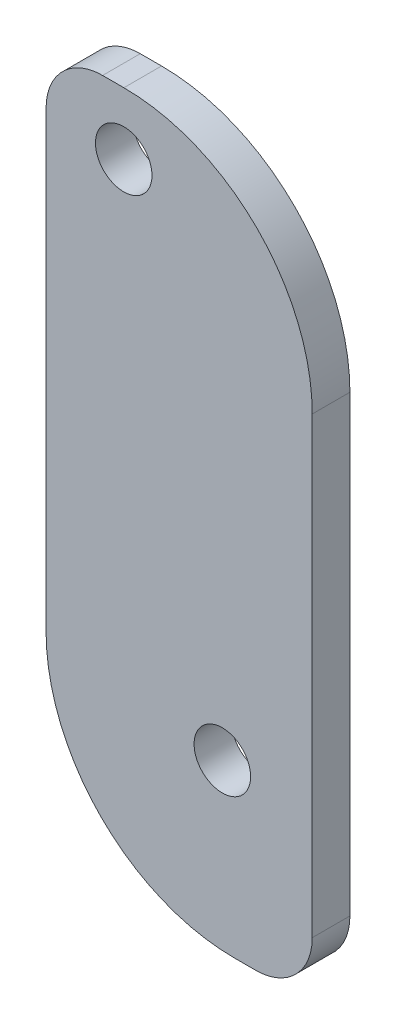
ISO-10303-21;
HEADER;
FILE_DESCRIPTION(('STEP AP214'),'2;1');
FILE_NAME('part.step','',(''),(''),'','','');
FILE_SCHEMA(('AUTOMOTIVE_DESIGN { 1 0 10303 214 1 1 1 1 }'));
ENDSEC;
DATA;
#1=APPLICATION_CONTEXT('core data for automotive mechanical design processes');
#2=APPLICATION_PROTOCOL_DEFINITION('international standard','automotive_design',2000,#1);
#3=PRODUCT_CONTEXT('',#1,'mechanical');
#4=PRODUCT('Part','Part','',(#3));
#5=PRODUCT_RELATED_PRODUCT_CATEGORY('part','',(#4));
#6=PRODUCT_DEFINITION_FORMATION('','',#4);
#7=PRODUCT_DEFINITION_CONTEXT('part definition',#1,'design');
#8=PRODUCT_DEFINITION('design','',#6,#7);
#9=PRODUCT_DEFINITION_SHAPE('','',#8);
#10=(LENGTH_UNIT() NAMED_UNIT(*) SI_UNIT(.MILLI.,.METRE.));
#11=(NAMED_UNIT(*) PLANE_ANGLE_UNIT() SI_UNIT($,.RADIAN.));
#12=(NAMED_UNIT(*) SI_UNIT($,.STERADIAN.) SOLID_ANGLE_UNIT());
#13=UNCERTAINTY_MEASURE_WITH_UNIT(LENGTH_MEASURE(1.E-05),#10,'distance_accuracy_value','');
#14=(GEOMETRIC_REPRESENTATION_CONTEXT(3) GLOBAL_UNCERTAINTY_ASSIGNED_CONTEXT((#13)) GLOBAL_UNIT_ASSIGNED_CONTEXT((#10,
#11,#12)) REPRESENTATION_CONTEXT('',''));
#15=CARTESIAN_POINT('',(0.,0.,0.));
#16=DIRECTION('',(0.,0.,1.));
#17=DIRECTION('',(1.,0.,0.));
#18=AXIS2_PLACEMENT_3D('',#15,#16,#17);
#19=CARTESIAN_POINT('',(0.00871256943322726,-6.70865291355919,2.));
#20=DIRECTION('',(0.,0.,-1.));
#21=DIRECTION('',(-1.,0.,0.));
#22=AXIS2_PLACEMENT_3D('',#19,#20,#21);
#23=PLANE('',#22);
#24=CARTESIAN_POINT('',(0.00871256943322726,-6.70865291355919,2.));
#25=DIRECTION('',(0.,0.,1.));
#26=DIRECTION('',(-1.,0.,0.));
#27=AXIS2_PLACEMENT_3D('',#24,#25,#26);
#28=CIRCLE('',#27,10.);
#29=CARTESIAN_POINT('',(10.0087125694332,-6.70865291355927,2.));
#30=VERTEX_POINT('',#29);
#31=CARTESIAN_POINT('',(0.0087125694331544,3.2913470864408,2.));
#32=VERTEX_POINT('',#31);
#33=EDGE_CURVE('E168',#30,#32,#28,.T.);
#34=ORIENTED_EDGE('',*,*,#33,.T.);
#35=DIRECTION('',(-1.,0.,0.));
#36=VECTOR('',#35,1.);
#37=CARTESIAN_POINT('',(-1.12103866827267,3.2913470864408,2.));
#38=LINE('',#37,#36);
#39=CARTESIAN_POINT('',(-1.12103866827267,3.2913470864408,2.));
#40=VERTEX_POINT('',#39);
#41=EDGE_CURVE('E106',#32,#40,#38,.T.);
#42=ORIENTED_EDGE('',*,*,#41,.T.);
#43=CARTESIAN_POINT('',(-1.12103866827269,0.291347086440805,2.));
#44=DIRECTION('',(0.,0.,1.));
#45=DIRECTION('',(1.,0.,0.));
#46=AXIS2_PLACEMENT_3D('',#43,#44,#45);
#47=CIRCLE('',#46,3.);
#48=CARTESIAN_POINT('',(-4.12103866827269,0.291347086440784,2.));
#49=VERTEX_POINT('',#48);
#50=EDGE_CURVE('E191',#40,#49,#47,.T.);
#51=ORIENTED_EDGE('',*,*,#50,.T.);
#52=DIRECTION('',(0.,-1.,0.));
#53=VECTOR('',#52,1.);
#54=CARTESIAN_POINT('',(-4.12103866827269,0.291347086440783,2.));
#55=LINE('',#54,#53);
#56=CARTESIAN_POINT('',(-4.12103866827269,-23.7855582931208,2.));
#57=VERTEX_POINT('',#56);
#58=EDGE_CURVE('E202',#49,#57,#55,.T.);
#59=ORIENTED_EDGE('',*,*,#58,.T.);
#60=CARTESIAN_POINT('',(5.87896133172731,-23.7855582931209,2.));
#61=DIRECTION('',(0.,0.,1.));
#62=DIRECTION('',(1.,0.,0.));
#63=AXIS2_PLACEMENT_3D('',#60,#61,#62);
#64=CIRCLE('',#63,10.);
#65=CARTESIAN_POINT('',(5.87896133172738,-33.7855582931209,2.));
#66=VERTEX_POINT('',#65);
#67=EDGE_CURVE('E124',#57,#66,#64,.T.);
#68=ORIENTED_EDGE('',*,*,#67,.T.);
#69=DIRECTION('',(1.,0.,0.));
#70=VECTOR('',#69,1.);
#71=CARTESIAN_POINT('',(5.87896133172738,-33.7855582931209,2.));
#72=LINE('',#71,#70);
#73=CARTESIAN_POINT('',(7.0087125694332,-33.7855582931209,2.));
#74=VERTEX_POINT('',#73);
#75=EDGE_CURVE('E116',#66,#74,#72,.T.);
#76=ORIENTED_EDGE('',*,*,#75,.T.);
#77=CARTESIAN_POINT('',(7.00871256943323,-30.7855582931209,2.));
#78=DIRECTION('',(0.,0.,1.));
#79=DIRECTION('',(1.,0.,0.));
#80=AXIS2_PLACEMENT_3D('',#77,#78,#79);
#81=CIRCLE('',#80,3.);
#82=CARTESIAN_POINT('',(10.0087125694332,-30.7855582931209,2.));
#83=VERTEX_POINT('',#82);
#84=EDGE_CURVE('E122',#74,#83,#81,.T.);
#85=ORIENTED_EDGE('',*,*,#84,.T.);
#86=DIRECTION('',(0.,1.,0.));
#87=VECTOR('',#86,1.);
#88=CARTESIAN_POINT('',(10.0087125694332,-6.70865291355927,2.));
#89=LINE('',#88,#87);
#90=EDGE_CURVE('E64',#83,#30,#89,.T.);
#91=ORIENTED_EDGE('',*,*,#90,.T.);
#92=EDGE_LOOP('',(#34,#42,#51,#59,#68,#76,#85,#91));
#93=FACE_BOUND('',#92,.T.);
#94=CARTESIAN_POINT('',(0.,0.,2.));
#95=DIRECTION('',(0.,0.,1.));
#96=DIRECTION('',(1.,0.,0.));
#97=AXIS2_PLACEMENT_3D('',#94,#95,#96);
#98=CIRCLE('',#97,1.5);
#99=CARTESIAN_POINT('',(1.5,0.,2.));
#100=VERTEX_POINT('',#99);
#101=EDGE_CURVE('E155',#100,#100,#98,.T.);
#102=ORIENTED_EDGE('',*,*,#101,.F.);
#103=EDGE_LOOP('',(#102));
#104=FACE_BOUND('',#103,.T.);
#105=CARTESIAN_POINT('',(5.23606643184794,-25.0200030799348,2.));
#106=DIRECTION('',(0.,0.,1.));
#107=DIRECTION('',(1.,0.,0.));
#108=AXIS2_PLACEMENT_3D('',#105,#106,#107);
#109=CIRCLE('',#108,1.5);
#110=CARTESIAN_POINT('',(6.73606643184794,-25.0200030799348,2.));
#111=VERTEX_POINT('',#110);
#112=EDGE_CURVE('E218',#111,#111,#109,.T.);
#113=ORIENTED_EDGE('',*,*,#112,.F.);
#114=EDGE_LOOP('',(#113));
#115=FACE_BOUND('',#114,.T.);
#116=ADVANCED_FACE('F44',(#93,#104,#115),#23,.F.);
#117=CARTESIAN_POINT('',(0.00871256943322726,-6.70865291355919,0.));
#118=DIRECTION('',(0.,0.,-1.));
#119=DIRECTION('',(-1.,0.,0.));
#120=AXIS2_PLACEMENT_3D('',#117,#118,#119);
#121=PLANE('',#120);
#122=CARTESIAN_POINT('',(0.,0.,0.));
#123=DIRECTION('',(0.,0.,1.));
#124=DIRECTION('',(1.,0.,0.));
#125=AXIS2_PLACEMENT_3D('',#122,#123,#124);
#126=CIRCLE('',#125,1.5);
#127=CARTESIAN_POINT('',(1.5,0.,0.));
#128=VERTEX_POINT('',#127);
#129=EDGE_CURVE('E214',#128,#128,#126,.T.);
#130=ORIENTED_EDGE('',*,*,#129,.T.);
#131=EDGE_LOOP('',(#130));
#132=FACE_BOUND('',#131,.T.);
#133=CARTESIAN_POINT('',(0.00871256943322726,-6.70865291355919,0.));
#134=DIRECTION('',(0.,0.,1.));
#135=DIRECTION('',(-1.,0.,0.));
#136=AXIS2_PLACEMENT_3D('',#133,#134,#135);
#137=CIRCLE('',#136,10.);
#138=CARTESIAN_POINT('',(10.0087125694332,-6.70865291355927,0.));
#139=VERTEX_POINT('',#138);
#140=CARTESIAN_POINT('',(0.0087125694331544,3.2913470864408,0.));
#141=VERTEX_POINT('',#140);
#142=EDGE_CURVE('E150',#139,#141,#137,.T.);
#143=ORIENTED_EDGE('',*,*,#142,.F.);
#144=DIRECTION('',(0.,1.,0.));
#145=VECTOR('',#144,1.);
#146=CARTESIAN_POINT('',(10.0087125694332,-6.70865291355927,0.));
#147=LINE('',#146,#145);
#148=CARTESIAN_POINT('',(10.0087125694332,-30.7855582931209,0.));
#149=VERTEX_POINT('',#148);
#150=EDGE_CURVE('E98',#149,#139,#147,.T.);
#151=ORIENTED_EDGE('',*,*,#150,.F.);
#152=CARTESIAN_POINT('',(7.00871256943323,-30.7855582931209,0.));
#153=DIRECTION('',(0.,0.,1.));
#154=DIRECTION('',(1.,0.,0.));
#155=AXIS2_PLACEMENT_3D('',#152,#153,#154);
#156=CIRCLE('',#155,3.);
#157=CARTESIAN_POINT('',(7.0087125694332,-33.7855582931209,0.));
#158=VERTEX_POINT('',#157);
#159=EDGE_CURVE('E95',#158,#149,#156,.T.);
#160=ORIENTED_EDGE('',*,*,#159,.F.);
#161=DIRECTION('',(1.,0.,0.));
#162=VECTOR('',#161,1.);
#163=CARTESIAN_POINT('',(5.87896133172738,-33.7855582931209,0.));
#164=LINE('',#163,#162);
#165=CARTESIAN_POINT('',(5.87896133172738,-33.7855582931209,0.));
#166=VERTEX_POINT('',#165);
#167=EDGE_CURVE('E131',#166,#158,#164,.T.);
#168=ORIENTED_EDGE('',*,*,#167,.F.);
#169=CARTESIAN_POINT('',(5.87896133172731,-23.7855582931209,0.));
#170=DIRECTION('',(0.,0.,1.));
#171=DIRECTION('',(1.,0.,0.));
#172=AXIS2_PLACEMENT_3D('',#169,#170,#171);
#173=CIRCLE('',#172,10.);
#174=CARTESIAN_POINT('',(-4.12103866827269,-23.7855582931208,0.));
#175=VERTEX_POINT('',#174);
#176=EDGE_CURVE('E161',#175,#166,#173,.T.);
#177=ORIENTED_EDGE('',*,*,#176,.F.);
#178=DIRECTION('',(0.,-1.,0.));
#179=VECTOR('',#178,1.);
#180=CARTESIAN_POINT('',(-4.12103866827269,0.291347086440783,0.));
#181=LINE('',#180,#179);
#182=CARTESIAN_POINT('',(-4.12103866827269,0.291347086440784,0.));
#183=VERTEX_POINT('',#182);
#184=EDGE_CURVE('E158',#183,#175,#181,.T.);
#185=ORIENTED_EDGE('',*,*,#184,.F.);
#186=CARTESIAN_POINT('',(-1.12103866827269,0.291347086440805,0.));
#187=DIRECTION('',(0.,0.,1.));
#188=DIRECTION('',(1.,0.,0.));
#189=AXIS2_PLACEMENT_3D('',#186,#187,#188);
#190=CIRCLE('',#189,3.);
#191=CARTESIAN_POINT('',(-1.12103866827267,3.2913470864408,0.));
#192=VERTEX_POINT('',#191);
#193=EDGE_CURVE('E154',#192,#183,#190,.T.);
#194=ORIENTED_EDGE('',*,*,#193,.F.);
#195=DIRECTION('',(-1.,0.,0.));
#196=VECTOR('',#195,1.);
#197=CARTESIAN_POINT('',(-1.12103866827267,3.2913470864408,0.));
#198=LINE('',#197,#196);
#199=EDGE_CURVE('E151',#141,#192,#198,.T.);
#200=ORIENTED_EDGE('',*,*,#199,.F.);
#201=EDGE_LOOP('',(#143,#151,#160,#168,#177,#185,#194,#200));
#202=FACE_BOUND('',#201,.T.);
#203=CARTESIAN_POINT('',(5.23606643184794,-25.0200030799348,0.));
#204=DIRECTION('',(0.,0.,1.));
#205=DIRECTION('',(1.,0.,0.));
#206=AXIS2_PLACEMENT_3D('',#203,#204,#205);
#207=CIRCLE('',#206,1.5);
#208=CARTESIAN_POINT('',(6.73606643184794,-25.0200030799348,0.));
#209=VERTEX_POINT('',#208);
#210=EDGE_CURVE('E224',#209,#209,#207,.T.);
#211=ORIENTED_EDGE('',*,*,#210,.T.);
#212=EDGE_LOOP('',(#211));
#213=FACE_BOUND('',#212,.T.);
#214=ADVANCED_FACE('F194',(#132,#202,#213),#121,.T.);
#215=CARTESIAN_POINT('',(0.00871256943322726,-6.70865291355919,2.));
#216=DIRECTION('',(0.,0.,-1.));
#217=DIRECTION('',(-1.,0.,0.));
#218=AXIS2_PLACEMENT_3D('',#215,#216,#217);
#219=CYLINDRICAL_SURFACE('',#218,10.);
#220=ORIENTED_EDGE('',*,*,#142,.T.);
#221=DIRECTION('',(0.,0.,-1.));
#222=VECTOR('',#221,1.);
#223=CARTESIAN_POINT('',(0.0087125694331544,3.2913470864408,2.));
#224=LINE('',#223,#222);
#225=EDGE_CURVE('E11',#32,#141,#224,.T.);
#226=ORIENTED_EDGE('',*,*,#225,.F.);
#227=ORIENTED_EDGE('',*,*,#33,.F.);
#228=DIRECTION('',(0.,0.,-1.));
#229=VECTOR('',#228,1.);
#230=CARTESIAN_POINT('',(10.0087125694332,-6.70865291355927,2.));
#231=LINE('',#230,#229);
#232=EDGE_CURVE('E141',#30,#139,#231,.T.);
#233=ORIENTED_EDGE('',*,*,#232,.T.);
#234=EDGE_LOOP('',(#220,#226,#227,#233));
#235=FACE_BOUND('',#234,.T.);
#236=ADVANCED_FACE('F50',(#235),#219,.T.);
#237=CARTESIAN_POINT('',(-1.12103866827267,3.2913470864408,2.));
#238=DIRECTION('',(0.,-1.,0.));
#239=DIRECTION('',(0.,0.,-1.));
#240=AXIS2_PLACEMENT_3D('',#237,#238,#239);
#241=PLANE('',#240);
#242=ORIENTED_EDGE('',*,*,#199,.T.);
#243=DIRECTION('',(0.,0.,-1.));
#244=VECTOR('',#243,1.);
#245=CARTESIAN_POINT('',(-1.12103866827267,3.2913470864408,2.));
#246=LINE('',#245,#244);
#247=EDGE_CURVE('E54',#40,#192,#246,.T.);
#248=ORIENTED_EDGE('',*,*,#247,.F.);
#249=ORIENTED_EDGE('',*,*,#41,.F.);
#250=ORIENTED_EDGE('',*,*,#225,.T.);
#251=EDGE_LOOP('',(#242,#248,#249,#250));
#252=FACE_BOUND('',#251,.T.);
#253=ADVANCED_FACE('F260',(#252),#241,.F.);
#254=CARTESIAN_POINT('',(-1.12103866827269,0.291347086440805,2.));
#255=DIRECTION('',(0.,0.,-1.));
#256=DIRECTION('',(-1.,0.,0.));
#257=AXIS2_PLACEMENT_3D('',#254,#255,#256);
#258=CYLINDRICAL_SURFACE('',#257,3.);
#259=ORIENTED_EDGE('',*,*,#193,.T.);
#260=DIRECTION('',(0.,0.,-1.));
#261=VECTOR('',#260,1.);
#262=CARTESIAN_POINT('',(-4.12103866827269,0.291347086440784,2.));
#263=LINE('',#262,#261);
#264=EDGE_CURVE('E182',#49,#183,#263,.T.);
#265=ORIENTED_EDGE('',*,*,#264,.F.);
#266=ORIENTED_EDGE('',*,*,#50,.F.);
#267=ORIENTED_EDGE('',*,*,#247,.T.);
#268=EDGE_LOOP('',(#259,#265,#266,#267));
#269=FACE_BOUND('',#268,.T.);
#270=ADVANCED_FACE('F186',(#269),#258,.T.);
#271=CARTESIAN_POINT('',(-4.12103866827269,0.291347086440783,2.));
#272=DIRECTION('',(1.,0.,0.));
#273=DIRECTION('',(0.,0.,-1.));
#274=AXIS2_PLACEMENT_3D('',#271,#272,#273);
#275=PLANE('',#274);
#276=ORIENTED_EDGE('',*,*,#184,.T.);
#277=DIRECTION('',(0.,0.,-1.));
#278=VECTOR('',#277,1.);
#279=CARTESIAN_POINT('',(-4.12103866827269,-23.7855582931208,2.));
#280=LINE('',#279,#278);
#281=EDGE_CURVE('E180',#57,#175,#280,.T.);
#282=ORIENTED_EDGE('',*,*,#281,.F.);
#283=ORIENTED_EDGE('',*,*,#58,.F.);
#284=ORIENTED_EDGE('',*,*,#264,.T.);
#285=EDGE_LOOP('',(#276,#282,#283,#284));
#286=FACE_BOUND('',#285,.T.);
#287=ADVANCED_FACE('F199',(#286),#275,.F.);
#288=CARTESIAN_POINT('',(5.87896133172731,-23.7855582931209,2.));
#289=DIRECTION('',(0.,0.,-1.));
#290=DIRECTION('',(-1.,0.,0.));
#291=AXIS2_PLACEMENT_3D('',#288,#289,#290);
#292=CYLINDRICAL_SURFACE('',#291,10.);
#293=ORIENTED_EDGE('',*,*,#176,.T.);
#294=DIRECTION('',(0.,0.,-1.));
#295=VECTOR('',#294,1.);
#296=CARTESIAN_POINT('',(5.87896133172738,-33.7855582931209,2.));
#297=LINE('',#296,#295);
#298=EDGE_CURVE('E136',#66,#166,#297,.T.);
#299=ORIENTED_EDGE('',*,*,#298,.F.);
#300=ORIENTED_EDGE('',*,*,#67,.F.);
#301=ORIENTED_EDGE('',*,*,#281,.T.);
#302=EDGE_LOOP('',(#293,#299,#300,#301));
#303=FACE_BOUND('',#302,.T.);
#304=ADVANCED_FACE('F201',(#303),#292,.T.);
#305=CARTESIAN_POINT('',(5.87896133172738,-33.7855582931209,2.));
#306=DIRECTION('',(0.,1.,0.));
#307=DIRECTION('',(0.,0.,1.));
#308=AXIS2_PLACEMENT_3D('',#305,#306,#307);
#309=PLANE('',#308);
#310=ORIENTED_EDGE('',*,*,#167,.T.);
#311=DIRECTION('',(0.,0.,-1.));
#312=VECTOR('',#311,1.);
#313=CARTESIAN_POINT('',(7.0087125694332,-33.7855582931209,2.));
#314=LINE('',#313,#312);
#315=EDGE_CURVE('E132',#74,#158,#314,.T.);
#316=ORIENTED_EDGE('',*,*,#315,.F.);
#317=ORIENTED_EDGE('',*,*,#75,.F.);
#318=ORIENTED_EDGE('',*,*,#298,.T.);
#319=EDGE_LOOP('',(#310,#316,#317,#318));
#320=FACE_BOUND('',#319,.T.);
#321=ADVANCED_FACE('F135',(#320),#309,.F.);
#322=CARTESIAN_POINT('',(7.00871256943323,-30.7855582931209,2.));
#323=DIRECTION('',(0.,0.,-1.));
#324=DIRECTION('',(-1.,0.,0.));
#325=AXIS2_PLACEMENT_3D('',#322,#323,#324);
#326=CYLINDRICAL_SURFACE('',#325,3.);
#327=ORIENTED_EDGE('',*,*,#159,.T.);
#328=DIRECTION('',(0.,0.,-1.));
#329=VECTOR('',#328,1.);
#330=CARTESIAN_POINT('',(10.0087125694332,-30.7855582931209,2.));
#331=LINE('',#330,#329);
#332=EDGE_CURVE('E140',#83,#149,#331,.T.);
#333=ORIENTED_EDGE('',*,*,#332,.F.);
#334=ORIENTED_EDGE('',*,*,#84,.F.);
#335=ORIENTED_EDGE('',*,*,#315,.T.);
#336=EDGE_LOOP('',(#327,#333,#334,#335));
#337=FACE_BOUND('',#336,.T.);
#338=ADVANCED_FACE('F138',(#337),#326,.T.);
#339=CARTESIAN_POINT('',(10.0087125694332,-6.70865291355927,2.));
#340=DIRECTION('',(-1.,0.,0.));
#341=DIRECTION('',(0.,0.,1.));
#342=AXIS2_PLACEMENT_3D('',#339,#340,#341);
#343=PLANE('',#342);
#344=ORIENTED_EDGE('',*,*,#150,.T.);
#345=ORIENTED_EDGE('',*,*,#232,.F.);
#346=ORIENTED_EDGE('',*,*,#90,.F.);
#347=ORIENTED_EDGE('',*,*,#332,.T.);
#348=EDGE_LOOP('',(#344,#345,#346,#347));
#349=FACE_BOUND('',#348,.T.);
#350=ADVANCED_FACE('F243',(#349),#343,.F.);
#351=CARTESIAN_POINT('',(0.,0.,2.));
#352=DIRECTION('',(0.,0.,-1.));
#353=DIRECTION('',(-1.,0.,0.));
#354=AXIS2_PLACEMENT_3D('',#351,#352,#353);
#355=CYLINDRICAL_SURFACE('',#354,1.5);
#356=ORIENTED_EDGE('',*,*,#101,.T.);
#357=EDGE_LOOP('',(#356));
#358=FACE_BOUND('',#357,.T.);
#359=ORIENTED_EDGE('',*,*,#129,.F.);
#360=EDGE_LOOP('',(#359));
#361=FACE_BOUND('',#360,.T.);
#362=ADVANCED_FACE('F245',(#358,#361),#355,.F.);
#363=CARTESIAN_POINT('',(5.23606643184794,-25.0200030799348,2.));
#364=DIRECTION('',(0.,0.,-1.));
#365=DIRECTION('',(-1.,0.,0.));
#366=AXIS2_PLACEMENT_3D('',#363,#364,#365);
#367=CYLINDRICAL_SURFACE('',#366,1.5);
#368=ORIENTED_EDGE('',*,*,#112,.T.);
#369=EDGE_LOOP('',(#368));
#370=FACE_BOUND('',#369,.T.);
#371=ORIENTED_EDGE('',*,*,#210,.F.);
#372=EDGE_LOOP('',(#371));
#373=FACE_BOUND('',#372,.T.);
#374=ADVANCED_FACE('F231',(#370,#373),#367,.F.);
#375=CLOSED_SHELL('',(#116,#214,#236,#253,#270,#287,#304,#321,#338,#350,#362,#374));
#376=MANIFOLD_SOLID_BREP('B2',#375);
#377=ADVANCED_BREP_SHAPE_REPRESENTATION('',(#18,#376),#14);
#378=SHAPE_DEFINITION_REPRESENTATION(#9,#377);
ENDSEC;
END-ISO-10303-21;
